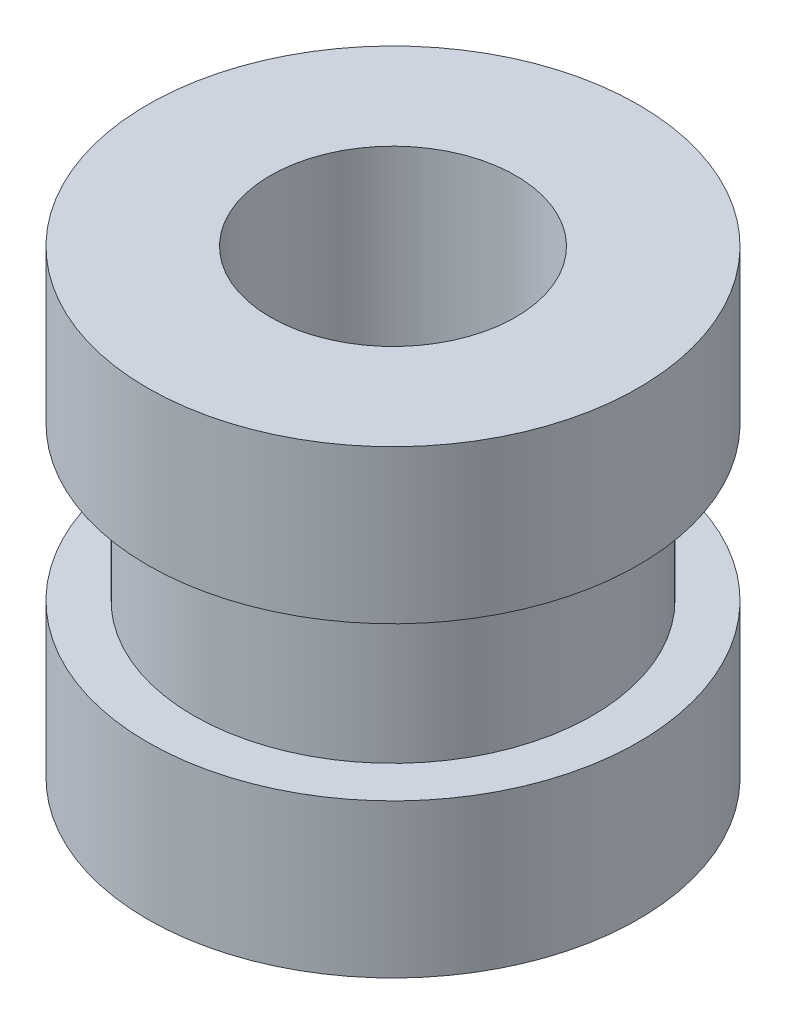
ISO-10303-21;
HEADER;
FILE_DESCRIPTION(('STEP AP214'),'2;1');
FILE_NAME('part.step','',(''),(''),'','','');
FILE_SCHEMA(('AUTOMOTIVE_DESIGN { 1 0 10303 214 1 1 1 1 }'));
ENDSEC;
DATA;
#1=APPLICATION_CONTEXT('core data for automotive mechanical design processes');
#2=APPLICATION_PROTOCOL_DEFINITION('international standard','automotive_design',2000,#1);
#3=PRODUCT_CONTEXT('',#1,'mechanical');
#4=PRODUCT('Part','Part','',(#3));
#5=PRODUCT_RELATED_PRODUCT_CATEGORY('part','',(#4));
#6=PRODUCT_DEFINITION_FORMATION('','',#4);
#7=PRODUCT_DEFINITION_CONTEXT('part definition',#1,'design');
#8=PRODUCT_DEFINITION('design','',#6,#7);
#9=PRODUCT_DEFINITION_SHAPE('','',#8);
#10=(LENGTH_UNIT() NAMED_UNIT(*) SI_UNIT(.MILLI.,.METRE.));
#11=(NAMED_UNIT(*) PLANE_ANGLE_UNIT() SI_UNIT($,.RADIAN.));
#12=(NAMED_UNIT(*) SI_UNIT($,.STERADIAN.) SOLID_ANGLE_UNIT());
#13=UNCERTAINTY_MEASURE_WITH_UNIT(LENGTH_MEASURE(1.E-05),#10,'distance_accuracy_value','');
#14=(GEOMETRIC_REPRESENTATION_CONTEXT(3) GLOBAL_UNCERTAINTY_ASSIGNED_CONTEXT((#13)) GLOBAL_UNIT_ASSIGNED_CONTEXT((#10,
#11,#12)) REPRESENTATION_CONTEXT('',''));
#15=CARTESIAN_POINT('',(0.,0.,0.));
#16=DIRECTION('',(0.,0.,1.));
#17=DIRECTION('',(1.,0.,0.));
#18=AXIS2_PLACEMENT_3D('',#15,#16,#17);
#19=CARTESIAN_POINT('',(0.,1.,0.));
#20=DIRECTION('',(0.,-1.,0.));
#21=DIRECTION('',(0.,0.,-1.));
#22=AXIS2_PLACEMENT_3D('',#19,#20,#21);
#23=CYLINDRICAL_SURFACE('',#22,1.6);
#24=CARTESIAN_POINT('',(0.,1.,0.));
#25=DIRECTION('',(0.,1.,0.));
#26=DIRECTION('',(0.,0.,1.));
#27=AXIS2_PLACEMENT_3D('',#24,#25,#26);
#28=CIRCLE('',#27,1.6);
#29=CARTESIAN_POINT('',(0.,1.,1.6));
#30=VERTEX_POINT('',#29);
#31=EDGE_CURVE('E45',#30,#30,#28,.T.);
#32=ORIENTED_EDGE('',*,*,#31,.F.);
#33=EDGE_LOOP('',(#32));
#34=FACE_BOUND('',#33,.T.);
#35=CARTESIAN_POINT('',(0.,0.,0.));
#36=DIRECTION('',(0.,1.,0.));
#37=DIRECTION('',(0.,0.,1.));
#38=AXIS2_PLACEMENT_3D('',#35,#36,#37);
#39=CIRCLE('',#38,1.6);
#40=CARTESIAN_POINT('',(0.,0.,1.6));
#41=VERTEX_POINT('',#40);
#42=EDGE_CURVE('E41',#41,#41,#39,.T.);
#43=ORIENTED_EDGE('',*,*,#42,.T.);
#44=EDGE_LOOP('',(#43));
#45=FACE_BOUND('',#44,.T.);
#46=ADVANCED_FACE('F38',(#34,#45),#23,.T.);
#47=CARTESIAN_POINT('',(0.,1.,0.));
#48=DIRECTION('',(0.,1.,0.));
#49=DIRECTION('',(0.,0.,1.));
#50=AXIS2_PLACEMENT_3D('',#47,#48,#49);
#51=PLANE('',#50);
#52=CARTESIAN_POINT('',(0.,1.,0.));
#53=DIRECTION('',(0.,1.,0.));
#54=DIRECTION('',(0.,0.,1.));
#55=AXIS2_PLACEMENT_3D('',#52,#53,#54);
#56=CIRCLE('',#55,1.3);
#57=CARTESIAN_POINT('',(0.,1.,1.3));
#58=VERTEX_POINT('',#57);
#59=EDGE_CURVE('E10',#58,#58,#56,.T.);
#60=ORIENTED_EDGE('',*,*,#59,.F.);
#61=EDGE_LOOP('',(#60));
#62=FACE_BOUND('',#61,.T.);
#63=ORIENTED_EDGE('',*,*,#31,.T.);
#64=EDGE_LOOP('',(#63));
#65=FACE_BOUND('',#64,.T.);
#66=ADVANCED_FACE('F92',(#62,#65),#51,.T.);
#67=CARTESIAN_POINT('',(0.,0.,0.));
#68=DIRECTION('',(0.,1.,0.));
#69=DIRECTION('',(0.,0.,1.));
#70=AXIS2_PLACEMENT_3D('',#67,#68,#69);
#71=PLANE('',#70);
#72=CARTESIAN_POINT('',(0.,0.,0.));
#73=DIRECTION('',(0.,1.,0.));
#74=DIRECTION('',(0.,0.,1.));
#75=AXIS2_PLACEMENT_3D('',#72,#73,#74);
#76=CIRCLE('',#75,0.799999999999999);
#77=CARTESIAN_POINT('',(0.,0.,0.799999999999999));
#78=VERTEX_POINT('',#77);
#79=EDGE_CURVE('E58',#78,#78,#76,.T.);
#80=ORIENTED_EDGE('',*,*,#79,.T.);
#81=EDGE_LOOP('',(#80));
#82=FACE_BOUND('',#81,.T.);
#83=ORIENTED_EDGE('',*,*,#42,.F.);
#84=EDGE_LOOP('',(#83));
#85=FACE_BOUND('',#84,.T.);
#86=ADVANCED_FACE('F97',(#82,#85),#71,.F.);
#87=CARTESIAN_POINT('',(0.,2.,0.));
#88=DIRECTION('',(0.,-1.,0.));
#89=DIRECTION('',(0.,0.,-1.));
#90=AXIS2_PLACEMENT_3D('',#87,#88,#89);
#91=CYLINDRICAL_SURFACE('',#90,1.3);
#92=CARTESIAN_POINT('',(0.,2.,0.));
#93=DIRECTION('',(0.,1.,0.));
#94=DIRECTION('',(0.,0.,1.));
#95=AXIS2_PLACEMENT_3D('',#92,#93,#94);
#96=CIRCLE('',#95,1.3);
#97=CARTESIAN_POINT('',(0.,2.,1.3));
#98=VERTEX_POINT('',#97);
#99=EDGE_CURVE('E51',#98,#98,#96,.T.);
#100=ORIENTED_EDGE('',*,*,#99,.F.);
#101=EDGE_LOOP('',(#100));
#102=FACE_BOUND('',#101,.T.);
#103=ORIENTED_EDGE('',*,*,#59,.T.);
#104=EDGE_LOOP('',(#103));
#105=FACE_BOUND('',#104,.T.);
#106=ADVANCED_FACE('F79',(#102,#105),#91,.T.);
#107=CARTESIAN_POINT('',(0.,3.,0.));
#108=DIRECTION('',(0.,-1.,0.));
#109=DIRECTION('',(0.,0.,-1.));
#110=AXIS2_PLACEMENT_3D('',#107,#108,#109);
#111=CYLINDRICAL_SURFACE('',#110,1.6);
#112=CARTESIAN_POINT('',(0.,3.,0.));
#113=DIRECTION('',(0.,1.,0.));
#114=DIRECTION('',(0.,0.,1.));
#115=AXIS2_PLACEMENT_3D('',#112,#113,#114);
#116=CIRCLE('',#115,1.6);
#117=CARTESIAN_POINT('',(0.,3.,1.6));
#118=VERTEX_POINT('',#117);
#119=EDGE_CURVE('E54',#118,#118,#116,.T.);
#120=ORIENTED_EDGE('',*,*,#119,.F.);
#121=EDGE_LOOP('',(#120));
#122=FACE_BOUND('',#121,.T.);
#123=CARTESIAN_POINT('',(0.,2.,0.));
#124=DIRECTION('',(0.,1.,0.));
#125=DIRECTION('',(0.,0.,1.));
#126=AXIS2_PLACEMENT_3D('',#123,#124,#125);
#127=CIRCLE('',#126,1.6);
#128=CARTESIAN_POINT('',(0.,2.,1.6));
#129=VERTEX_POINT('',#128);
#130=EDGE_CURVE('E55',#129,#129,#127,.T.);
#131=ORIENTED_EDGE('',*,*,#130,.T.);
#132=EDGE_LOOP('',(#131));
#133=FACE_BOUND('',#132,.T.);
#134=ADVANCED_FACE('F73',(#122,#133),#111,.T.);
#135=CARTESIAN_POINT('',(0.,3.,0.));
#136=DIRECTION('',(0.,1.,0.));
#137=DIRECTION('',(0.,0.,1.));
#138=AXIS2_PLACEMENT_3D('',#135,#136,#137);
#139=PLANE('',#138);
#140=CARTESIAN_POINT('',(0.,3.,0.));
#141=DIRECTION('',(0.,1.,0.));
#142=DIRECTION('',(0.,0.,1.));
#143=AXIS2_PLACEMENT_3D('',#140,#141,#142);
#144=CIRCLE('',#143,0.799999999999988);
#145=CARTESIAN_POINT('',(0.,3.,0.799999999999988));
#146=VERTEX_POINT('',#145);
#147=EDGE_CURVE('E63',#146,#146,#144,.T.);
#148=ORIENTED_EDGE('',*,*,#147,.F.);
#149=EDGE_LOOP('',(#148));
#150=FACE_BOUND('',#149,.T.);
#151=ORIENTED_EDGE('',*,*,#119,.T.);
#152=EDGE_LOOP('',(#151));
#153=FACE_BOUND('',#152,.T.);
#154=ADVANCED_FACE('F69',(#150,#153),#139,.T.);
#155=CARTESIAN_POINT('',(0.,2.,0.));
#156=DIRECTION('',(0.,1.,0.));
#157=DIRECTION('',(0.,0.,1.));
#158=AXIS2_PLACEMENT_3D('',#155,#156,#157);
#159=PLANE('',#158);
#160=ORIENTED_EDGE('',*,*,#99,.T.);
#161=EDGE_LOOP('',(#160));
#162=FACE_BOUND('',#161,.T.);
#163=ORIENTED_EDGE('',*,*,#130,.F.);
#164=EDGE_LOOP('',(#163));
#165=FACE_BOUND('',#164,.T.);
#166=ADVANCED_FACE('F72',(#162,#165),#159,.F.);
#167=CARTESIAN_POINT('',(0.,3.,0.));
#168=DIRECTION('',(0.,1.,0.));
#169=DIRECTION('',(0.,0.,1.));
#170=AXIS2_PLACEMENT_3D('',#167,#168,#169);
#171=CYLINDRICAL_SURFACE('',#170,0.799999999999994);
#172=ORIENTED_EDGE('',*,*,#79,.F.);
#173=EDGE_LOOP('',(#172));
#174=FACE_BOUND('',#173,.T.);
#175=ORIENTED_EDGE('',*,*,#147,.T.);
#176=EDGE_LOOP('',(#175));
#177=FACE_BOUND('',#176,.T.);
#178=ADVANCED_FACE('F67',(#174,#177),#171,.F.);
#179=CLOSED_SHELL('',(#46,#66,#86,#106,#134,#154,#166,#178));
#180=MANIFOLD_SOLID_BREP('B2',#179);
#181=ADVANCED_BREP_SHAPE_REPRESENTATION('',(#18,#180),#14);
#182=SHAPE_DEFINITION_REPRESENTATION(#9,#181);
ENDSEC;
END-ISO-10303-21;
